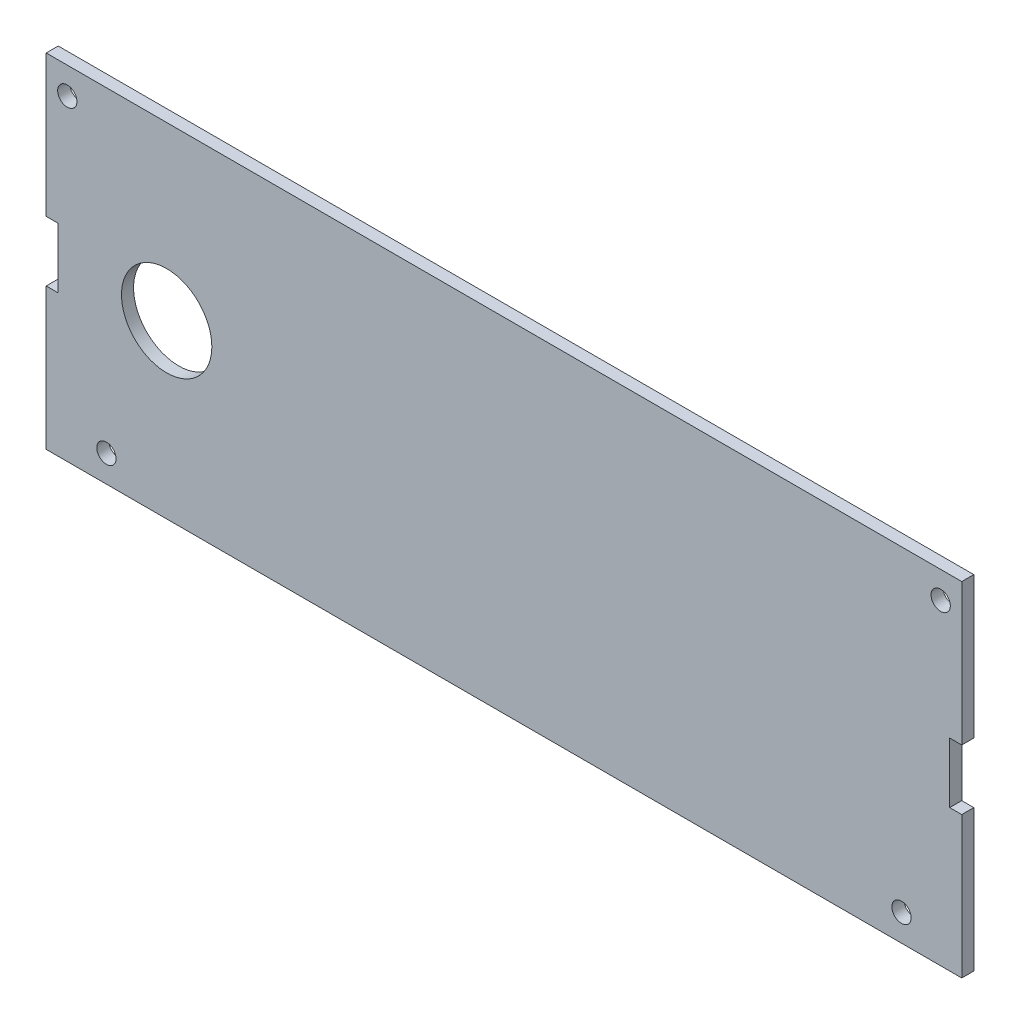
ISO-10303-21;
HEADER;
FILE_DESCRIPTION(('STEP AP214'),'2;1');
FILE_NAME('part.step','',(''),(''),'','','');
FILE_SCHEMA(('AUTOMOTIVE_DESIGN { 1 0 10303 214 1 1 1 1 }'));
ENDSEC;
DATA;
#1=APPLICATION_CONTEXT('core data for automotive mechanical design processes');
#2=APPLICATION_PROTOCOL_DEFINITION('international standard','automotive_design',2000,#1);
#3=PRODUCT_CONTEXT('',#1,'mechanical');
#4=PRODUCT('Part','Part','',(#3));
#5=PRODUCT_RELATED_PRODUCT_CATEGORY('part','',(#4));
#6=PRODUCT_DEFINITION_FORMATION('','',#4);
#7=PRODUCT_DEFINITION_CONTEXT('part definition',#1,'design');
#8=PRODUCT_DEFINITION('design','',#6,#7);
#9=PRODUCT_DEFINITION_SHAPE('','',#8);
#10=(LENGTH_UNIT() NAMED_UNIT(*) SI_UNIT(.MILLI.,.METRE.));
#11=(NAMED_UNIT(*) PLANE_ANGLE_UNIT() SI_UNIT($,.RADIAN.));
#12=(NAMED_UNIT(*) SI_UNIT($,.STERADIAN.) SOLID_ANGLE_UNIT());
#13=UNCERTAINTY_MEASURE_WITH_UNIT(LENGTH_MEASURE(1.E-05),#10,'distance_accuracy_value','');
#14=(GEOMETRIC_REPRESENTATION_CONTEXT(3) GLOBAL_UNCERTAINTY_ASSIGNED_CONTEXT((#13)) GLOBAL_UNIT_ASSIGNED_CONTEXT((#10,
#11,#12)) REPRESENTATION_CONTEXT('',''));
#15=CARTESIAN_POINT('',(0.,0.,0.));
#16=DIRECTION('',(0.,0.,1.));
#17=DIRECTION('',(1.,0.,0.));
#18=AXIS2_PLACEMENT_3D('',#15,#16,#17);
#19=CARTESIAN_POINT('',(74.,0.,2.));
#20=DIRECTION('',(1.,0.,0.));
#21=DIRECTION('',(0.,0.,-1.));
#22=AXIS2_PLACEMENT_3D('',#19,#20,#21);
#23=PLANE('',#22);
#24=DIRECTION('',(0.,-1.,0.));
#25=VECTOR('',#24,1.);
#26=CARTESIAN_POINT('',(74.,0.,0.));
#27=LINE('',#26,#25);
#28=CARTESIAN_POINT('',(74.,5.,0.));
#29=VERTEX_POINT('',#28);
#30=CARTESIAN_POINT('',(74.,-5.,0.));
#31=VERTEX_POINT('',#30);
#32=EDGE_CURVE('E194',#29,#31,#27,.T.);
#33=ORIENTED_EDGE('',*,*,#32,.F.);
#34=DIRECTION('',(0.,0.,-1.));
#35=VECTOR('',#34,1.);
#36=CARTESIAN_POINT('',(74.,5.,2.));
#37=LINE('',#36,#35);
#38=CARTESIAN_POINT('',(74.,5.,2.));
#39=VERTEX_POINT('',#38);
#40=EDGE_CURVE('E12',#39,#29,#37,.T.);
#41=ORIENTED_EDGE('',*,*,#40,.F.);
#42=DIRECTION('',(0.,-1.,0.));
#43=VECTOR('',#42,1.);
#44=CARTESIAN_POINT('',(74.,0.,2.));
#45=LINE('',#44,#43);
#46=CARTESIAN_POINT('',(74.,-5.,2.));
#47=VERTEX_POINT('',#46);
#48=EDGE_CURVE('E160',#39,#47,#45,.T.);
#49=ORIENTED_EDGE('',*,*,#48,.T.);
#50=DIRECTION('',(0.,0.,-1.));
#51=VECTOR('',#50,1.);
#52=CARTESIAN_POINT('',(74.,-5.,2.));
#53=LINE('',#52,#51);
#54=EDGE_CURVE('E51',#47,#31,#53,.T.);
#55=ORIENTED_EDGE('',*,*,#54,.T.);
#56=EDGE_LOOP('',(#33,#41,#49,#55));
#57=FACE_BOUND('',#56,.T.);
#58=ADVANCED_FACE('F35',(#57),#23,.T.);
#59=CARTESIAN_POINT('',(0.,5.00000000000001,2.));
#60=DIRECTION('',(0.,1.,0.));
#61=DIRECTION('',(-1.,0.,0.));
#62=AXIS2_PLACEMENT_3D('',#59,#60,#61);
#63=PLANE('',#62);
#64=DIRECTION('',(1.,0.,0.));
#65=VECTOR('',#64,1.);
#66=CARTESIAN_POINT('',(0.,5.00000000000001,0.));
#67=LINE('',#66,#65);
#68=CARTESIAN_POINT('',(76.,5.,0.));
#69=VERTEX_POINT('',#68);
#70=EDGE_CURVE('E197',#29,#69,#67,.T.);
#71=ORIENTED_EDGE('',*,*,#70,.T.);
#72=DIRECTION('',(0.,0.,-1.));
#73=VECTOR('',#72,1.);
#74=CARTESIAN_POINT('',(76.,5.,2.));
#75=LINE('',#74,#73);
#76=CARTESIAN_POINT('',(76.,5.,2.));
#77=VERTEX_POINT('',#76);
#78=EDGE_CURVE('E43',#77,#69,#75,.T.);
#79=ORIENTED_EDGE('',*,*,#78,.F.);
#80=DIRECTION('',(1.,0.,0.));
#81=VECTOR('',#80,1.);
#82=CARTESIAN_POINT('',(0.,5.00000000000001,2.));
#83=LINE('',#82,#81);
#84=EDGE_CURVE('E155',#39,#77,#83,.T.);
#85=ORIENTED_EDGE('',*,*,#84,.F.);
#86=ORIENTED_EDGE('',*,*,#40,.T.);
#87=EDGE_LOOP('',(#71,#79,#85,#86));
#88=FACE_BOUND('',#87,.T.);
#89=ADVANCED_FACE('F244',(#88),#63,.F.);
#90=CARTESIAN_POINT('',(76.,0.,2.));
#91=DIRECTION('',(1.,0.,0.));
#92=DIRECTION('',(0.,1.,0.));
#93=AXIS2_PLACEMENT_3D('',#90,#91,#92);
#94=PLANE('',#93);
#95=DIRECTION('',(0.,-1.,0.));
#96=VECTOR('',#95,1.);
#97=CARTESIAN_POINT('',(76.,0.,0.));
#98=LINE('',#97,#96);
#99=CARTESIAN_POINT('',(76.,28.5,0.));
#100=VERTEX_POINT('',#99);
#101=EDGE_CURVE('E203',#100,#69,#98,.T.);
#102=ORIENTED_EDGE('',*,*,#101,.F.);
#103=DIRECTION('',(0.,0.,-1.));
#104=VECTOR('',#103,1.);
#105=CARTESIAN_POINT('',(76.,28.5,2.));
#106=LINE('',#105,#104);
#107=CARTESIAN_POINT('',(76.,28.5,2.));
#108=VERTEX_POINT('',#107);
#109=EDGE_CURVE('E240',#108,#100,#106,.T.);
#110=ORIENTED_EDGE('',*,*,#109,.F.);
#111=DIRECTION('',(0.,-1.,0.));
#112=VECTOR('',#111,1.);
#113=CARTESIAN_POINT('',(76.,0.,2.));
#114=LINE('',#113,#112);
#115=EDGE_CURVE('E149',#108,#77,#114,.T.);
#116=ORIENTED_EDGE('',*,*,#115,.T.);
#117=ORIENTED_EDGE('',*,*,#78,.T.);
#118=EDGE_LOOP('',(#102,#110,#116,#117));
#119=FACE_BOUND('',#118,.T.);
#120=ADVANCED_FACE('F242',(#119),#94,.T.);
#121=CARTESIAN_POINT('',(0.,28.5,2.));
#122=DIRECTION('',(0.,1.,0.));
#123=DIRECTION('',(0.,0.,1.));
#124=AXIS2_PLACEMENT_3D('',#121,#122,#123);
#125=PLANE('',#124);
#126=DIRECTION('',(1.,0.,0.));
#127=VECTOR('',#126,1.);
#128=CARTESIAN_POINT('',(0.,28.5,0.));
#129=LINE('',#128,#127);
#130=CARTESIAN_POINT('',(-76.,28.5,0.));
#131=VERTEX_POINT('',#130);
#132=EDGE_CURVE('E208',#131,#100,#129,.T.);
#133=ORIENTED_EDGE('',*,*,#132,.F.);
#134=DIRECTION('',(0.,0.,-1.));
#135=VECTOR('',#134,1.);
#136=CARTESIAN_POINT('',(-76.,28.5,2.));
#137=LINE('',#136,#135);
#138=CARTESIAN_POINT('',(-76.,28.5,2.));
#139=VERTEX_POINT('',#138);
#140=EDGE_CURVE('E238',#139,#131,#137,.T.);
#141=ORIENTED_EDGE('',*,*,#140,.F.);
#142=DIRECTION('',(1.,0.,0.));
#143=VECTOR('',#142,1.);
#144=CARTESIAN_POINT('',(0.,28.5,2.));
#145=LINE('',#144,#143);
#146=EDGE_CURVE('E154',#139,#108,#145,.T.);
#147=ORIENTED_EDGE('',*,*,#146,.T.);
#148=ORIENTED_EDGE('',*,*,#109,.T.);
#149=EDGE_LOOP('',(#133,#141,#147,#148));
#150=FACE_BOUND('',#149,.T.);
#151=ADVANCED_FACE('F249',(#150),#125,.T.);
#152=CARTESIAN_POINT('',(-76.,0.,2.));
#153=DIRECTION('',(1.,0.,0.));
#154=DIRECTION('',(0.,1.,0.));
#155=AXIS2_PLACEMENT_3D('',#152,#153,#154);
#156=PLANE('',#155);
#157=DIRECTION('',(0.,-1.,0.));
#158=VECTOR('',#157,1.);
#159=CARTESIAN_POINT('',(-76.,0.,0.));
#160=LINE('',#159,#158);
#161=CARTESIAN_POINT('',(-76.,5.,0.));
#162=VERTEX_POINT('',#161);
#163=EDGE_CURVE('E212',#131,#162,#160,.T.);
#164=ORIENTED_EDGE('',*,*,#163,.T.);
#165=DIRECTION('',(0.,0.,-1.));
#166=VECTOR('',#165,1.);
#167=CARTESIAN_POINT('',(-76.,5.,2.));
#168=LINE('',#167,#166);
#169=CARTESIAN_POINT('',(-76.,5.,2.));
#170=VERTEX_POINT('',#169);
#171=EDGE_CURVE('E236',#170,#162,#168,.T.);
#172=ORIENTED_EDGE('',*,*,#171,.F.);
#173=DIRECTION('',(0.,-1.,0.));
#174=VECTOR('',#173,1.);
#175=CARTESIAN_POINT('',(-76.,0.,2.));
#176=LINE('',#175,#174);
#177=EDGE_CURVE('E159',#139,#170,#176,.T.);
#178=ORIENTED_EDGE('',*,*,#177,.F.);
#179=ORIENTED_EDGE('',*,*,#140,.T.);
#180=EDGE_LOOP('',(#164,#172,#178,#179));
#181=FACE_BOUND('',#180,.T.);
#182=ADVANCED_FACE('F258',(#181),#156,.F.);
#183=CARTESIAN_POINT('',(0.,5.00000000000001,2.));
#184=DIRECTION('',(0.,-1.,0.));
#185=DIRECTION('',(1.,0.,0.));
#186=AXIS2_PLACEMENT_3D('',#183,#184,#185);
#187=PLANE('',#186);
#188=DIRECTION('',(-1.,0.,0.));
#189=VECTOR('',#188,1.);
#190=CARTESIAN_POINT('',(0.,5.00000000000001,0.));
#191=LINE('',#190,#189);
#192=CARTESIAN_POINT('',(-74.,5.,0.));
#193=VERTEX_POINT('',#192);
#194=EDGE_CURVE('E215',#193,#162,#191,.T.);
#195=ORIENTED_EDGE('',*,*,#194,.F.);
#196=DIRECTION('',(0.,0.,-1.));
#197=VECTOR('',#196,1.);
#198=CARTESIAN_POINT('',(-74.,5.,2.));
#199=LINE('',#198,#197);
#200=CARTESIAN_POINT('',(-74.,5.,2.));
#201=VERTEX_POINT('',#200);
#202=EDGE_CURVE('E234',#201,#193,#199,.T.);
#203=ORIENTED_EDGE('',*,*,#202,.F.);
#204=DIRECTION('',(-1.,0.,0.));
#205=VECTOR('',#204,1.);
#206=CARTESIAN_POINT('',(0.,5.00000000000001,2.));
#207=LINE('',#206,#205);
#208=EDGE_CURVE('E255',#201,#170,#207,.T.);
#209=ORIENTED_EDGE('',*,*,#208,.T.);
#210=ORIENTED_EDGE('',*,*,#171,.T.);
#211=EDGE_LOOP('',(#195,#203,#209,#210));
#212=FACE_BOUND('',#211,.T.);
#213=ADVANCED_FACE('F261',(#212),#187,.T.);
#214=CARTESIAN_POINT('',(-74.,0.,2.));
#215=DIRECTION('',(1.,0.,0.));
#216=DIRECTION('',(0.,0.,-1.));
#217=AXIS2_PLACEMENT_3D('',#214,#215,#216);
#218=PLANE('',#217);
#219=DIRECTION('',(0.,-1.,0.));
#220=VECTOR('',#219,1.);
#221=CARTESIAN_POINT('',(-74.,0.,0.));
#222=LINE('',#221,#220);
#223=CARTESIAN_POINT('',(-74.,-5.,0.));
#224=VERTEX_POINT('',#223);
#225=EDGE_CURVE('E219',#193,#224,#222,.T.);
#226=ORIENTED_EDGE('',*,*,#225,.T.);
#227=DIRECTION('',(0.,0.,-1.));
#228=VECTOR('',#227,1.);
#229=CARTESIAN_POINT('',(-74.,-5.,2.));
#230=LINE('',#229,#228);
#231=CARTESIAN_POINT('',(-74.,-5.,2.));
#232=VERTEX_POINT('',#231);
#233=EDGE_CURVE('E231',#232,#224,#230,.T.);
#234=ORIENTED_EDGE('',*,*,#233,.F.);
#235=DIRECTION('',(0.,-1.,0.));
#236=VECTOR('',#235,1.);
#237=CARTESIAN_POINT('',(-74.,0.,2.));
#238=LINE('',#237,#236);
#239=EDGE_CURVE('E263',#201,#232,#238,.T.);
#240=ORIENTED_EDGE('',*,*,#239,.F.);
#241=ORIENTED_EDGE('',*,*,#202,.T.);
#242=EDGE_LOOP('',(#226,#234,#240,#241));
#243=FACE_BOUND('',#242,.T.);
#244=ADVANCED_FACE('F301',(#243),#218,.F.);
#245=CARTESIAN_POINT('',(0.,-4.99999999999997,2.));
#246=DIRECTION('',(0.,-1.,0.));
#247=DIRECTION('',(1.,0.,0.));
#248=AXIS2_PLACEMENT_3D('',#245,#246,#247);
#249=PLANE('',#248);
#250=DIRECTION('',(-1.,0.,0.));
#251=VECTOR('',#250,1.);
#252=CARTESIAN_POINT('',(0.,-4.99999999999997,0.));
#253=LINE('',#252,#251);
#254=CARTESIAN_POINT('',(-76.,-5.,0.));
#255=VERTEX_POINT('',#254);
#256=EDGE_CURVE('E221',#224,#255,#253,.T.);
#257=ORIENTED_EDGE('',*,*,#256,.T.);
#258=DIRECTION('',(0.,0.,-1.));
#259=VECTOR('',#258,1.);
#260=CARTESIAN_POINT('',(-76.,-5.,2.));
#261=LINE('',#260,#259);
#262=CARTESIAN_POINT('',(-76.,-5.,2.));
#263=VERTEX_POINT('',#262);
#264=EDGE_CURVE('E228',#263,#255,#261,.T.);
#265=ORIENTED_EDGE('',*,*,#264,.F.);
#266=DIRECTION('',(-1.,0.,0.));
#267=VECTOR('',#266,1.);
#268=CARTESIAN_POINT('',(0.,-4.99999999999997,2.));
#269=LINE('',#268,#267);
#270=EDGE_CURVE('E265',#232,#263,#269,.T.);
#271=ORIENTED_EDGE('',*,*,#270,.F.);
#272=ORIENTED_EDGE('',*,*,#233,.T.);
#273=EDGE_LOOP('',(#257,#265,#271,#272));
#274=FACE_BOUND('',#273,.T.);
#275=ADVANCED_FACE('F273',(#274),#249,.F.);
#276=CARTESIAN_POINT('',(-76.,-28.5,0.));
#277=VERTEX_POINT('',#276);
#278=EDGE_CURVE('E216',#255,#277,#160,.T.);
#279=ORIENTED_EDGE('',*,*,#278,.T.);
#280=DIRECTION('',(0.,0.,-1.));
#281=VECTOR('',#280,1.);
#282=CARTESIAN_POINT('',(-76.,-28.5,2.));
#283=LINE('',#282,#281);
#284=CARTESIAN_POINT('',(-76.,-28.5,2.));
#285=VERTEX_POINT('',#284);
#286=EDGE_CURVE('E144',#285,#277,#283,.T.);
#287=ORIENTED_EDGE('',*,*,#286,.F.);
#288=EDGE_CURVE('E133',#263,#285,#176,.T.);
#289=ORIENTED_EDGE('',*,*,#288,.F.);
#290=ORIENTED_EDGE('',*,*,#264,.T.);
#291=EDGE_LOOP('',(#279,#287,#289,#290));
#292=FACE_BOUND('',#291,.T.);
#293=ADVANCED_FACE('F277',(#292),#156,.F.);
#294=CARTESIAN_POINT('',(0.,-28.5,2.));
#295=DIRECTION('',(0.,1.,0.));
#296=DIRECTION('',(0.,0.,1.));
#297=AXIS2_PLACEMENT_3D('',#294,#295,#296);
#298=PLANE('',#297);
#299=DIRECTION('',(1.,0.,0.));
#300=VECTOR('',#299,1.);
#301=CARTESIAN_POINT('',(0.,-28.5,0.));
#302=LINE('',#301,#300);
#303=CARTESIAN_POINT('',(76.,-28.5,0.));
#304=VERTEX_POINT('',#303);
#305=EDGE_CURVE('E141',#277,#304,#302,.T.);
#306=ORIENTED_EDGE('',*,*,#305,.T.);
#307=DIRECTION('',(0.,0.,-1.));
#308=VECTOR('',#307,1.);
#309=CARTESIAN_POINT('',(76.,-28.5,2.));
#310=LINE('',#309,#308);
#311=CARTESIAN_POINT('',(76.,-28.5,2.));
#312=VERTEX_POINT('',#311);
#313=EDGE_CURVE('E138',#312,#304,#310,.T.);
#314=ORIENTED_EDGE('',*,*,#313,.F.);
#315=DIRECTION('',(1.,0.,0.));
#316=VECTOR('',#315,1.);
#317=CARTESIAN_POINT('',(0.,-28.5,2.));
#318=LINE('',#317,#316);
#319=EDGE_CURVE('E125',#285,#312,#318,.T.);
#320=ORIENTED_EDGE('',*,*,#319,.F.);
#321=ORIENTED_EDGE('',*,*,#286,.T.);
#322=EDGE_LOOP('',(#306,#314,#320,#321));
#323=FACE_BOUND('',#322,.T.);
#324=ADVANCED_FACE('F139',(#323),#298,.F.);
#325=CARTESIAN_POINT('',(76.,-5.,0.));
#326=VERTEX_POINT('',#325);
#327=EDGE_CURVE('E209',#326,#304,#98,.T.);
#328=ORIENTED_EDGE('',*,*,#327,.F.);
#329=DIRECTION('',(0.,0.,-1.));
#330=VECTOR('',#329,1.);
#331=CARTESIAN_POINT('',(76.,-5.,2.));
#332=LINE('',#331,#330);
#333=CARTESIAN_POINT('',(76.,-5.,2.));
#334=VERTEX_POINT('',#333);
#335=EDGE_CURVE('E88',#334,#326,#332,.T.);
#336=ORIENTED_EDGE('',*,*,#335,.F.);
#337=EDGE_CURVE('E131',#334,#312,#114,.T.);
#338=ORIENTED_EDGE('',*,*,#337,.T.);
#339=ORIENTED_EDGE('',*,*,#313,.T.);
#340=EDGE_LOOP('',(#328,#336,#338,#339));
#341=FACE_BOUND('',#340,.T.);
#342=ADVANCED_FACE('F146',(#341),#94,.T.);
#343=CARTESIAN_POINT('',(0.,-4.99999999999997,2.));
#344=DIRECTION('',(0.,1.,0.));
#345=DIRECTION('',(-1.,0.,0.));
#346=AXIS2_PLACEMENT_3D('',#343,#344,#345);
#347=PLANE('',#346);
#348=DIRECTION('',(1.,0.,0.));
#349=VECTOR('',#348,1.);
#350=CARTESIAN_POINT('',(0.,-4.99999999999997,0.));
#351=LINE('',#350,#349);
#352=EDGE_CURVE('E162',#31,#326,#351,.T.);
#353=ORIENTED_EDGE('',*,*,#352,.F.);
#354=ORIENTED_EDGE('',*,*,#54,.F.);
#355=DIRECTION('',(1.,0.,0.));
#356=VECTOR('',#355,1.);
#357=CARTESIAN_POINT('',(0.,-4.99999999999997,2.));
#358=LINE('',#357,#356);
#359=EDGE_CURVE('E147',#47,#334,#358,.T.);
#360=ORIENTED_EDGE('',*,*,#359,.T.);
#361=ORIENTED_EDGE('',*,*,#335,.T.);
#362=EDGE_LOOP('',(#353,#354,#360,#361));
#363=FACE_BOUND('',#362,.T.);
#364=ADVANCED_FACE('F278',(#363),#347,.T.);
#365=CARTESIAN_POINT('',(0.,0.,2.));
#366=DIRECTION('',(0.,0.,1.));
#367=DIRECTION('',(1.,0.,0.));
#368=AXIS2_PLACEMENT_3D('',#365,#366,#367);
#369=PLANE('',#368);
#370=CARTESIAN_POINT('',(-72.5,24.05,2.));
#371=DIRECTION('',(0.,0.,1.));
#372=DIRECTION('',(1.,0.,0.));
#373=AXIS2_PLACEMENT_3D('',#370,#371,#372);
#374=CIRCLE('',#373,1.6);
#375=CARTESIAN_POINT('',(-70.9,24.05,2.));
#376=VERTEX_POINT('',#375);
#377=EDGE_CURVE('E189',#376,#376,#374,.T.);
#378=ORIENTED_EDGE('',*,*,#377,.F.);
#379=EDGE_LOOP('',(#378));
#380=FACE_BOUND('',#379,.T.);
#381=CARTESIAN_POINT('',(72.5,24.05,2.));
#382=DIRECTION('',(0.,0.,1.));
#383=DIRECTION('',(1.,0.,0.));
#384=AXIS2_PLACEMENT_3D('',#381,#382,#383);
#385=CIRCLE('',#384,1.6);
#386=CARTESIAN_POINT('',(74.1,24.05,2.));
#387=VERTEX_POINT('',#386);
#388=EDGE_CURVE('E183',#387,#387,#385,.T.);
#389=ORIENTED_EDGE('',*,*,#388,.F.);
#390=EDGE_LOOP('',(#389));
#391=FACE_BOUND('',#390,.T.);
#392=CARTESIAN_POINT('',(66.,-24.05,2.));
#393=DIRECTION('',(0.,0.,1.));
#394=DIRECTION('',(1.,0.,0.));
#395=AXIS2_PLACEMENT_3D('',#392,#393,#394);
#396=CIRCLE('',#395,1.6);
#397=CARTESIAN_POINT('',(67.6,-24.05,2.));
#398=VERTEX_POINT('',#397);
#399=EDGE_CURVE('E177',#398,#398,#396,.T.);
#400=ORIENTED_EDGE('',*,*,#399,.F.);
#401=EDGE_LOOP('',(#400));
#402=FACE_BOUND('',#401,.T.);
#403=CARTESIAN_POINT('',(-66.,-24.05,2.));
#404=DIRECTION('',(0.,0.,1.));
#405=DIRECTION('',(1.,0.,0.));
#406=AXIS2_PLACEMENT_3D('',#403,#404,#405);
#407=CIRCLE('',#406,1.6);
#408=CARTESIAN_POINT('',(-64.4,-24.05,2.));
#409=VERTEX_POINT('',#408);
#410=EDGE_CURVE('E171',#409,#409,#407,.T.);
#411=ORIENTED_EDGE('',*,*,#410,.F.);
#412=EDGE_LOOP('',(#411));
#413=FACE_BOUND('',#412,.T.);
#414=CARTESIAN_POINT('',(-56.,0.,2.));
#415=DIRECTION('',(0.,0.,1.));
#416=DIRECTION('',(1.,0.,0.));
#417=AXIS2_PLACEMENT_3D('',#414,#415,#416);
#418=CIRCLE('',#417,7.5);
#419=CARTESIAN_POINT('',(-48.5,0.,2.));
#420=VERTEX_POINT('',#419);
#421=EDGE_CURVE('E165',#420,#420,#418,.T.);
#422=ORIENTED_EDGE('',*,*,#421,.F.);
#423=EDGE_LOOP('',(#422));
#424=FACE_BOUND('',#423,.T.);
#425=ORIENTED_EDGE('',*,*,#48,.F.);
#426=ORIENTED_EDGE('',*,*,#84,.T.);
#427=ORIENTED_EDGE('',*,*,#115,.F.);
#428=ORIENTED_EDGE('',*,*,#146,.F.);
#429=ORIENTED_EDGE('',*,*,#177,.T.);
#430=ORIENTED_EDGE('',*,*,#208,.F.);
#431=ORIENTED_EDGE('',*,*,#239,.T.);
#432=ORIENTED_EDGE('',*,*,#270,.T.);
#433=ORIENTED_EDGE('',*,*,#288,.T.);
#434=ORIENTED_EDGE('',*,*,#319,.T.);
#435=ORIENTED_EDGE('',*,*,#337,.F.);
#436=ORIENTED_EDGE('',*,*,#359,.F.);
#437=EDGE_LOOP('',(#425,#426,#427,#428,#429,#430,#431,#432,#433,#434,#435,#436));
#438=FACE_BOUND('',#437,.T.);
#439=ADVANCED_FACE('F128',(#380,#391,#402,#413,#424,#438),#369,.T.);
#440=CARTESIAN_POINT('',(0.,0.,0.));
#441=DIRECTION('',(0.,0.,1.));
#442=DIRECTION('',(1.,0.,0.));
#443=AXIS2_PLACEMENT_3D('',#440,#441,#442);
#444=PLANE('',#443);
#445=CARTESIAN_POINT('',(-72.5,24.05,0.));
#446=DIRECTION('',(0.,0.,1.));
#447=DIRECTION('',(1.,0.,0.));
#448=AXIS2_PLACEMENT_3D('',#445,#446,#447);
#449=CIRCLE('',#448,1.6);
#450=CARTESIAN_POINT('',(-70.9,24.05,0.));
#451=VERTEX_POINT('',#450);
#452=EDGE_CURVE('E192',#451,#451,#449,.T.);
#453=ORIENTED_EDGE('',*,*,#452,.T.);
#454=EDGE_LOOP('',(#453));
#455=FACE_BOUND('',#454,.T.);
#456=CARTESIAN_POINT('',(72.5,24.05,0.));
#457=DIRECTION('',(0.,0.,1.));
#458=DIRECTION('',(1.,0.,0.));
#459=AXIS2_PLACEMENT_3D('',#456,#457,#458);
#460=CIRCLE('',#459,1.6);
#461=CARTESIAN_POINT('',(74.1,24.05,0.));
#462=VERTEX_POINT('',#461);
#463=EDGE_CURVE('E186',#462,#462,#460,.T.);
#464=ORIENTED_EDGE('',*,*,#463,.T.);
#465=EDGE_LOOP('',(#464));
#466=FACE_BOUND('',#465,.T.);
#467=CARTESIAN_POINT('',(66.,-24.05,0.));
#468=DIRECTION('',(0.,0.,1.));
#469=DIRECTION('',(1.,0.,0.));
#470=AXIS2_PLACEMENT_3D('',#467,#468,#469);
#471=CIRCLE('',#470,1.6);
#472=CARTESIAN_POINT('',(67.6,-24.05,0.));
#473=VERTEX_POINT('',#472);
#474=EDGE_CURVE('E180',#473,#473,#471,.T.);
#475=ORIENTED_EDGE('',*,*,#474,.T.);
#476=EDGE_LOOP('',(#475));
#477=FACE_BOUND('',#476,.T.);
#478=CARTESIAN_POINT('',(-66.,-24.05,0.));
#479=DIRECTION('',(0.,0.,1.));
#480=DIRECTION('',(1.,0.,0.));
#481=AXIS2_PLACEMENT_3D('',#478,#479,#480);
#482=CIRCLE('',#481,1.6);
#483=CARTESIAN_POINT('',(-64.4,-24.05,0.));
#484=VERTEX_POINT('',#483);
#485=EDGE_CURVE('E174',#484,#484,#482,.T.);
#486=ORIENTED_EDGE('',*,*,#485,.T.);
#487=EDGE_LOOP('',(#486));
#488=FACE_BOUND('',#487,.T.);
#489=CARTESIAN_POINT('',(-56.,0.,0.));
#490=DIRECTION('',(0.,0.,1.));
#491=DIRECTION('',(1.,0.,0.));
#492=AXIS2_PLACEMENT_3D('',#489,#490,#491);
#493=CIRCLE('',#492,7.5);
#494=CARTESIAN_POINT('',(-48.5,0.,0.));
#495=VERTEX_POINT('',#494);
#496=EDGE_CURVE('E168',#495,#495,#493,.T.);
#497=ORIENTED_EDGE('',*,*,#496,.T.);
#498=EDGE_LOOP('',(#497));
#499=FACE_BOUND('',#498,.T.);
#500=ORIENTED_EDGE('',*,*,#32,.T.);
#501=ORIENTED_EDGE('',*,*,#352,.T.);
#502=ORIENTED_EDGE('',*,*,#327,.T.);
#503=ORIENTED_EDGE('',*,*,#305,.F.);
#504=ORIENTED_EDGE('',*,*,#278,.F.);
#505=ORIENTED_EDGE('',*,*,#256,.F.);
#506=ORIENTED_EDGE('',*,*,#225,.F.);
#507=ORIENTED_EDGE('',*,*,#194,.T.);
#508=ORIENTED_EDGE('',*,*,#163,.F.);
#509=ORIENTED_EDGE('',*,*,#132,.T.);
#510=ORIENTED_EDGE('',*,*,#101,.T.);
#511=ORIENTED_EDGE('',*,*,#70,.F.);
#512=EDGE_LOOP('',(#500,#501,#502,#503,#504,#505,#506,#507,#508,#509,#510,#511));
#513=FACE_BOUND('',#512,.T.);
#514=ADVANCED_FACE('F245',(#455,#466,#477,#488,#499,#513),#444,.F.);
#515=CARTESIAN_POINT('',(-56.,0.,0.));
#516=DIRECTION('',(0.,0.,1.));
#517=DIRECTION('',(1.,0.,0.));
#518=AXIS2_PLACEMENT_3D('',#515,#516,#517);
#519=CYLINDRICAL_SURFACE('',#518,7.5);
#520=ORIENTED_EDGE('',*,*,#496,.F.);
#521=EDGE_LOOP('',(#520));
#522=FACE_BOUND('',#521,.T.);
#523=ORIENTED_EDGE('',*,*,#421,.T.);
#524=EDGE_LOOP('',(#523));
#525=FACE_BOUND('',#524,.T.);
#526=ADVANCED_FACE('F337',(#522,#525),#519,.F.);
#527=CARTESIAN_POINT('',(-66.,-24.05,0.));
#528=DIRECTION('',(0.,0.,1.));
#529=DIRECTION('',(1.,0.,0.));
#530=AXIS2_PLACEMENT_3D('',#527,#528,#529);
#531=CYLINDRICAL_SURFACE('',#530,1.6);
#532=ORIENTED_EDGE('',*,*,#485,.F.);
#533=EDGE_LOOP('',(#532));
#534=FACE_BOUND('',#533,.T.);
#535=ORIENTED_EDGE('',*,*,#410,.T.);
#536=EDGE_LOOP('',(#535));
#537=FACE_BOUND('',#536,.T.);
#538=ADVANCED_FACE('F345',(#534,#537),#531,.F.);
#539=CARTESIAN_POINT('',(66.,-24.05,0.));
#540=DIRECTION('',(0.,0.,1.));
#541=DIRECTION('',(1.,0.,0.));
#542=AXIS2_PLACEMENT_3D('',#539,#540,#541);
#543=CYLINDRICAL_SURFACE('',#542,1.6);
#544=ORIENTED_EDGE('',*,*,#474,.F.);
#545=EDGE_LOOP('',(#544));
#546=FACE_BOUND('',#545,.T.);
#547=ORIENTED_EDGE('',*,*,#399,.T.);
#548=EDGE_LOOP('',(#547));
#549=FACE_BOUND('',#548,.T.);
#550=ADVANCED_FACE('F355',(#546,#549),#543,.F.);
#551=CARTESIAN_POINT('',(72.5,24.05,0.));
#552=DIRECTION('',(0.,0.,1.));
#553=DIRECTION('',(1.,0.,0.));
#554=AXIS2_PLACEMENT_3D('',#551,#552,#553);
#555=CYLINDRICAL_SURFACE('',#554,1.6);
#556=ORIENTED_EDGE('',*,*,#463,.F.);
#557=EDGE_LOOP('',(#556));
#558=FACE_BOUND('',#557,.T.);
#559=ORIENTED_EDGE('',*,*,#388,.T.);
#560=EDGE_LOOP('',(#559));
#561=FACE_BOUND('',#560,.T.);
#562=ADVANCED_FACE('F365',(#558,#561),#555,.F.);
#563=CARTESIAN_POINT('',(-72.5,24.05,0.));
#564=DIRECTION('',(0.,0.,1.));
#565=DIRECTION('',(1.,0.,0.));
#566=AXIS2_PLACEMENT_3D('',#563,#564,#565);
#567=CYLINDRICAL_SURFACE('',#566,1.6);
#568=ORIENTED_EDGE('',*,*,#452,.F.);
#569=EDGE_LOOP('',(#568));
#570=FACE_BOUND('',#569,.T.);
#571=ORIENTED_EDGE('',*,*,#377,.T.);
#572=EDGE_LOOP('',(#571));
#573=FACE_BOUND('',#572,.T.);
#574=ADVANCED_FACE('F375',(#570,#573),#567,.F.);
#575=CLOSED_SHELL('',(#58,#89,#120,#151,#182,#213,#244,#275,#293,#324,#342,#364,#439,#514,#526,
#538,#550,#562,#574));
#576=MANIFOLD_SOLID_BREP('B2',#575);
#577=ADVANCED_BREP_SHAPE_REPRESENTATION('',(#18,#576),#14);
#578=SHAPE_DEFINITION_REPRESENTATION(#9,#577);
ENDSEC;
END-ISO-10303-21;
